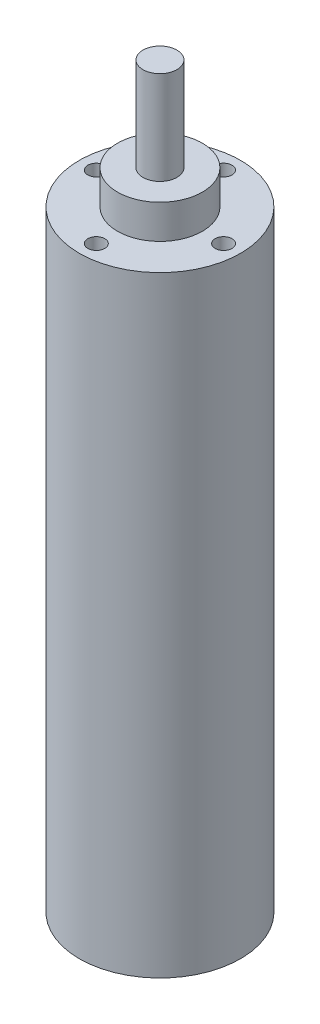
ISO-10303-21;
HEADER;
FILE_DESCRIPTION(('STEP AP214'),'2;1');
FILE_NAME('part.step','',(''),(''),'','','');
FILE_SCHEMA(('AUTOMOTIVE_DESIGN { 1 0 10303 214 1 1 1 1 }'));
ENDSEC;
DATA;
#1=APPLICATION_CONTEXT('core data for automotive mechanical design processes');
#2=APPLICATION_PROTOCOL_DEFINITION('international standard','automotive_design',2000,#1);
#3=PRODUCT_CONTEXT('',#1,'mechanical');
#4=PRODUCT('Part','Part','',(#3));
#5=PRODUCT_RELATED_PRODUCT_CATEGORY('part','',(#4));
#6=PRODUCT_DEFINITION_FORMATION('','',#4);
#7=PRODUCT_DEFINITION_CONTEXT('part definition',#1,'design');
#8=PRODUCT_DEFINITION('design','',#6,#7);
#9=PRODUCT_DEFINITION_SHAPE('','',#8);
#10=(LENGTH_UNIT() NAMED_UNIT(*) SI_UNIT(.MILLI.,.METRE.));
#11=(NAMED_UNIT(*) PLANE_ANGLE_UNIT() SI_UNIT($,.RADIAN.));
#12=(NAMED_UNIT(*) SI_UNIT($,.STERADIAN.) SOLID_ANGLE_UNIT());
#13=UNCERTAINTY_MEASURE_WITH_UNIT(LENGTH_MEASURE(1.E-05),#10,'distance_accuracy_value','');
#14=(GEOMETRIC_REPRESENTATION_CONTEXT(3) GLOBAL_UNCERTAINTY_ASSIGNED_CONTEXT((#13)) GLOBAL_UNIT_ASSIGNED_CONTEXT((#10,
#11,#12)) REPRESENTATION_CONTEXT('',''));
#15=CARTESIAN_POINT('',(0.,0.,0.));
#16=DIRECTION('',(0.,0.,1.));
#17=DIRECTION('',(1.,0.,0.));
#18=AXIS2_PLACEMENT_3D('',#15,#16,#17);
#19=CARTESIAN_POINT('',(0.,76.,0.));
#20=DIRECTION('',(0.,1.,0.));
#21=DIRECTION('',(0.,0.,1.));
#22=AXIS2_PLACEMENT_3D('',#19,#20,#21);
#23=PLANE('',#22);
#24=CARTESIAN_POINT('',(0.,76.,0.));
#25=DIRECTION('',(0.,1.,0.));
#26=DIRECTION('',(0.,0.,1.));
#27=AXIS2_PLACEMENT_3D('',#24,#25,#26);
#28=CIRCLE('',#27,5.);
#29=CARTESIAN_POINT('',(0.,76.,5.));
#30=VERTEX_POINT('',#29);
#31=EDGE_CURVE('E46',#30,#30,#28,.T.);
#32=ORIENTED_EDGE('',*,*,#31,.T.);
#33=EDGE_LOOP('',(#32));
#34=FACE_BOUND('',#33,.T.);
#35=CARTESIAN_POINT('',(0.,76.,0.));
#36=DIRECTION('',(0.,1.,0.));
#37=DIRECTION('',(0.,0.,1.));
#38=AXIS2_PLACEMENT_3D('',#35,#36,#37);
#39=CIRCLE('',#38,2.);
#40=CARTESIAN_POINT('',(0.,76.,2.));
#41=VERTEX_POINT('',#40);
#42=EDGE_CURVE('E54',#41,#41,#39,.T.);
#43=ORIENTED_EDGE('',*,*,#42,.F.);
#44=EDGE_LOOP('',(#43));
#45=FACE_BOUND('',#44,.T.);
#46=ADVANCED_FACE('F35',(#34,#45),#23,.T.);
#47=CARTESIAN_POINT('',(0.,72.,0.));
#48=DIRECTION('',(0.,1.,0.));
#49=DIRECTION('',(0.,0.,1.));
#50=AXIS2_PLACEMENT_3D('',#47,#48,#49);
#51=PLANE('',#50);
#52=CARTESIAN_POINT('',(0.,72.,-7.5));
#53=DIRECTION('',(0.,1.,0.));
#54=DIRECTION('',(0.,0.,1.));
#55=AXIS2_PLACEMENT_3D('',#52,#53,#54);
#56=CIRCLE('',#55,1.);
#57=CARTESIAN_POINT('',(0.,72.,-6.5));
#58=VERTEX_POINT('',#57);
#59=EDGE_CURVE('E63',#58,#58,#56,.T.);
#60=ORIENTED_EDGE('',*,*,#59,.F.);
#61=EDGE_LOOP('',(#60));
#62=FACE_BOUND('',#61,.T.);
#63=CARTESIAN_POINT('',(0.,72.,7.5));
#64=DIRECTION('',(0.,1.,0.));
#65=DIRECTION('',(0.,0.,1.));
#66=AXIS2_PLACEMENT_3D('',#63,#64,#65);
#67=CIRCLE('',#66,1.);
#68=CARTESIAN_POINT('',(0.,72.,8.5));
#69=VERTEX_POINT('',#68);
#70=EDGE_CURVE('E75',#69,#69,#67,.T.);
#71=ORIENTED_EDGE('',*,*,#70,.F.);
#72=EDGE_LOOP('',(#71));
#73=FACE_BOUND('',#72,.T.);
#74=CARTESIAN_POINT('',(-7.5,72.,0.));
#75=DIRECTION('',(0.,1.,0.));
#76=DIRECTION('',(0.,0.,1.));
#77=AXIS2_PLACEMENT_3D('',#74,#75,#76);
#78=CIRCLE('',#77,1.);
#79=CARTESIAN_POINT('',(-7.5,72.,1.));
#80=VERTEX_POINT('',#79);
#81=EDGE_CURVE('E69',#80,#80,#78,.T.);
#82=ORIENTED_EDGE('',*,*,#81,.F.);
#83=EDGE_LOOP('',(#82));
#84=FACE_BOUND('',#83,.T.);
#85=CARTESIAN_POINT('',(7.5,72.,0.));
#86=DIRECTION('',(0.,1.,0.));
#87=DIRECTION('',(0.,0.,1.));
#88=AXIS2_PLACEMENT_3D('',#85,#86,#87);
#89=CIRCLE('',#88,1.);
#90=CARTESIAN_POINT('',(7.5,72.,0.999999999999999));
#91=VERTEX_POINT('',#90);
#92=EDGE_CURVE('E60',#91,#91,#89,.T.);
#93=ORIENTED_EDGE('',*,*,#92,.F.);
#94=EDGE_LOOP('',(#93));
#95=FACE_BOUND('',#94,.T.);
#96=CARTESIAN_POINT('',(0.,72.,0.));
#97=DIRECTION('',(0.,1.,0.));
#98=DIRECTION('',(0.,0.,1.));
#99=AXIS2_PLACEMENT_3D('',#96,#97,#98);
#100=CIRCLE('',#99,9.5);
#101=CARTESIAN_POINT('',(0.,72.,9.5));
#102=VERTEX_POINT('',#101);
#103=EDGE_CURVE('E10',#102,#102,#100,.T.);
#104=ORIENTED_EDGE('',*,*,#103,.T.);
#105=EDGE_LOOP('',(#104));
#106=FACE_BOUND('',#105,.T.);
#107=CARTESIAN_POINT('',(0.,72.,0.));
#108=DIRECTION('',(0.,1.,0.));
#109=DIRECTION('',(0.,0.,1.));
#110=AXIS2_PLACEMENT_3D('',#107,#108,#109);
#111=CIRCLE('',#110,5.);
#112=CARTESIAN_POINT('',(0.,72.,5.));
#113=VERTEX_POINT('',#112);
#114=EDGE_CURVE('E48',#113,#113,#111,.T.);
#115=ORIENTED_EDGE('',*,*,#114,.F.);
#116=EDGE_LOOP('',(#115));
#117=FACE_BOUND('',#116,.T.);
#118=ADVANCED_FACE('F86',(#62,#73,#84,#95,#106,#117),#51,.T.);
#119=CARTESIAN_POINT('',(0.,72.,0.));
#120=DIRECTION('',(0.,-1.,0.));
#121=DIRECTION('',(0.,0.,-1.));
#122=AXIS2_PLACEMENT_3D('',#119,#120,#121);
#123=CYLINDRICAL_SURFACE('',#122,9.5);
#124=ORIENTED_EDGE('',*,*,#103,.F.);
#125=EDGE_LOOP('',(#124));
#126=FACE_BOUND('',#125,.T.);
#127=CARTESIAN_POINT('',(0.,0.,0.));
#128=DIRECTION('',(0.,1.,0.));
#129=DIRECTION('',(0.,0.,1.));
#130=AXIS2_PLACEMENT_3D('',#127,#128,#129);
#131=CIRCLE('',#130,9.5);
#132=CARTESIAN_POINT('',(0.,0.,9.5));
#133=VERTEX_POINT('',#132);
#134=EDGE_CURVE('E39',#133,#133,#131,.T.);
#135=ORIENTED_EDGE('',*,*,#134,.T.);
#136=EDGE_LOOP('',(#135));
#137=FACE_BOUND('',#136,.T.);
#138=ADVANCED_FACE('F37',(#126,#137),#123,.T.);
#139=CARTESIAN_POINT('',(0.,0.,0.));
#140=DIRECTION('',(0.,1.,0.));
#141=DIRECTION('',(0.,0.,1.));
#142=AXIS2_PLACEMENT_3D('',#139,#140,#141);
#143=PLANE('',#142);
#144=ORIENTED_EDGE('',*,*,#134,.F.);
#145=EDGE_LOOP('',(#144));
#146=FACE_BOUND('',#145,.T.);
#147=ADVANCED_FACE('F101',(#146),#143,.F.);
#148=CARTESIAN_POINT('',(0.,76.,0.));
#149=DIRECTION('',(0.,-1.,0.));
#150=DIRECTION('',(0.,0.,-1.));
#151=AXIS2_PLACEMENT_3D('',#148,#149,#150);
#152=CYLINDRICAL_SURFACE('',#151,5.);
#153=ORIENTED_EDGE('',*,*,#31,.F.);
#154=EDGE_LOOP('',(#153));
#155=FACE_BOUND('',#154,.T.);
#156=ORIENTED_EDGE('',*,*,#114,.T.);
#157=EDGE_LOOP('',(#156));
#158=FACE_BOUND('',#157,.T.);
#159=ADVANCED_FACE('F98',(#155,#158),#152,.T.);
#160=CARTESIAN_POINT('',(0.,87.,0.));
#161=DIRECTION('',(0.,-1.,0.));
#162=DIRECTION('',(0.,0.,-1.));
#163=AXIS2_PLACEMENT_3D('',#160,#161,#162);
#164=CYLINDRICAL_SURFACE('',#163,2.);
#165=CARTESIAN_POINT('',(0.,87.,0.));
#166=DIRECTION('',(0.,1.,0.));
#167=DIRECTION('',(0.,0.,1.));
#168=AXIS2_PLACEMENT_3D('',#165,#166,#167);
#169=CIRCLE('',#168,2.);
#170=CARTESIAN_POINT('',(0.,87.,2.));
#171=VERTEX_POINT('',#170);
#172=EDGE_CURVE('E51',#171,#171,#169,.T.);
#173=ORIENTED_EDGE('',*,*,#172,.F.);
#174=EDGE_LOOP('',(#173));
#175=FACE_BOUND('',#174,.T.);
#176=ORIENTED_EDGE('',*,*,#42,.T.);
#177=EDGE_LOOP('',(#176));
#178=FACE_BOUND('',#177,.T.);
#179=ADVANCED_FACE('F100',(#175,#178),#164,.T.);
#180=CARTESIAN_POINT('',(0.,87.,0.));
#181=DIRECTION('',(0.,1.,0.));
#182=DIRECTION('',(0.,0.,1.));
#183=AXIS2_PLACEMENT_3D('',#180,#181,#182);
#184=PLANE('',#183);
#185=ORIENTED_EDGE('',*,*,#172,.T.);
#186=EDGE_LOOP('',(#185));
#187=FACE_BOUND('',#186,.T.);
#188=ADVANCED_FACE('F108',(#187),#184,.T.);
#189=CARTESIAN_POINT('',(7.5,69.,0.));
#190=DIRECTION('',(0.,1.,0.));
#191=DIRECTION('',(0.,0.,1.));
#192=AXIS2_PLACEMENT_3D('',#189,#190,#191);
#193=CYLINDRICAL_SURFACE('',#192,1.);
#194=CARTESIAN_POINT('',(7.5,69.,0.));
#195=DIRECTION('',(0.,1.,0.));
#196=DIRECTION('',(0.,0.,1.));
#197=AXIS2_PLACEMENT_3D('',#194,#195,#196);
#198=CIRCLE('',#197,1.);
#199=CARTESIAN_POINT('',(7.5,69.,0.999999999999999));
#200=VERTEX_POINT('',#199);
#201=EDGE_CURVE('E57',#200,#200,#198,.T.);
#202=ORIENTED_EDGE('',*,*,#201,.F.);
#203=EDGE_LOOP('',(#202));
#204=FACE_BOUND('',#203,.T.);
#205=ORIENTED_EDGE('',*,*,#92,.T.);
#206=EDGE_LOOP('',(#205));
#207=FACE_BOUND('',#206,.T.);
#208=ADVANCED_FACE('F122',(#204,#207),#193,.F.);
#209=CARTESIAN_POINT('',(0.,69.,0.));
#210=DIRECTION('',(0.,1.,0.));
#211=DIRECTION('',(0.,0.,1.));
#212=AXIS2_PLACEMENT_3D('',#209,#210,#211);
#213=PLANE('',#212);
#214=ORIENTED_EDGE('',*,*,#201,.T.);
#215=EDGE_LOOP('',(#214));
#216=FACE_BOUND('',#215,.T.);
#217=ADVANCED_FACE('F126',(#216),#213,.T.);
#218=CARTESIAN_POINT('',(-7.5,69.,0.));
#219=DIRECTION('',(0.,1.,0.));
#220=DIRECTION('',(0.,0.,1.));
#221=AXIS2_PLACEMENT_3D('',#218,#219,#220);
#222=CYLINDRICAL_SURFACE('',#221,1.);
#223=CARTESIAN_POINT('',(-7.5,69.,0.));
#224=DIRECTION('',(0.,1.,0.));
#225=DIRECTION('',(0.,0.,1.));
#226=AXIS2_PLACEMENT_3D('',#223,#224,#225);
#227=CIRCLE('',#226,1.);
#228=CARTESIAN_POINT('',(-7.5,69.,1.));
#229=VERTEX_POINT('',#228);
#230=EDGE_CURVE('E66',#229,#229,#227,.T.);
#231=ORIENTED_EDGE('',*,*,#230,.F.);
#232=EDGE_LOOP('',(#231));
#233=FACE_BOUND('',#232,.T.);
#234=ORIENTED_EDGE('',*,*,#81,.T.);
#235=EDGE_LOOP('',(#234));
#236=FACE_BOUND('',#235,.T.);
#237=ADVANCED_FACE('F130',(#233,#236),#222,.F.);
#238=CARTESIAN_POINT('',(-7.5,69.,0.));
#239=DIRECTION('',(0.,1.,0.));
#240=DIRECTION('',(0.,0.,1.));
#241=AXIS2_PLACEMENT_3D('',#238,#239,#240);
#242=PLANE('',#241);
#243=ORIENTED_EDGE('',*,*,#230,.T.);
#244=EDGE_LOOP('',(#243));
#245=FACE_BOUND('',#244,.T.);
#246=ADVANCED_FACE('F132',(#245),#242,.T.);
#247=CARTESIAN_POINT('',(0.,69.,7.5));
#248=DIRECTION('',(0.,1.,0.));
#249=DIRECTION('',(0.,0.,1.));
#250=AXIS2_PLACEMENT_3D('',#247,#248,#249);
#251=CYLINDRICAL_SURFACE('',#250,1.);
#252=CARTESIAN_POINT('',(0.,69.,7.5));
#253=DIRECTION('',(0.,1.,0.));
#254=DIRECTION('',(0.,0.,1.));
#255=AXIS2_PLACEMENT_3D('',#252,#253,#254);
#256=CIRCLE('',#255,1.);
#257=CARTESIAN_POINT('',(0.,69.,8.5));
#258=VERTEX_POINT('',#257);
#259=EDGE_CURVE('E72',#258,#258,#256,.T.);
#260=ORIENTED_EDGE('',*,*,#259,.F.);
#261=EDGE_LOOP('',(#260));
#262=FACE_BOUND('',#261,.T.);
#263=ORIENTED_EDGE('',*,*,#70,.T.);
#264=EDGE_LOOP('',(#263));
#265=FACE_BOUND('',#264,.T.);
#266=ADVANCED_FACE('F135',(#262,#265),#251,.F.);
#267=CARTESIAN_POINT('',(0.,69.,7.5));
#268=DIRECTION('',(0.,1.,0.));
#269=DIRECTION('',(0.,0.,1.));
#270=AXIS2_PLACEMENT_3D('',#267,#268,#269);
#271=PLANE('',#270);
#272=ORIENTED_EDGE('',*,*,#259,.T.);
#273=EDGE_LOOP('',(#272));
#274=FACE_BOUND('',#273,.T.);
#275=ADVANCED_FACE('F140',(#274),#271,.T.);
#276=CARTESIAN_POINT('',(0.,69.,-7.5));
#277=DIRECTION('',(0.,1.,0.));
#278=DIRECTION('',(0.,0.,1.));
#279=AXIS2_PLACEMENT_3D('',#276,#277,#278);
#280=CYLINDRICAL_SURFACE('',#279,1.);
#281=CARTESIAN_POINT('',(0.,69.,-7.5));
#282=DIRECTION('',(0.,1.,0.));
#283=DIRECTION('',(0.,0.,1.));
#284=AXIS2_PLACEMENT_3D('',#281,#282,#283);
#285=CIRCLE('',#284,1.);
#286=CARTESIAN_POINT('',(0.,69.,-6.5));
#287=VERTEX_POINT('',#286);
#288=EDGE_CURVE('E78',#287,#287,#285,.T.);
#289=ORIENTED_EDGE('',*,*,#288,.F.);
#290=EDGE_LOOP('',(#289));
#291=FACE_BOUND('',#290,.T.);
#292=ORIENTED_EDGE('',*,*,#59,.T.);
#293=EDGE_LOOP('',(#292));
#294=FACE_BOUND('',#293,.T.);
#295=ADVANCED_FACE('F84',(#291,#294),#280,.F.);
#296=CARTESIAN_POINT('',(0.,69.,0.));
#297=DIRECTION('',(0.,1.,0.));
#298=DIRECTION('',(0.,0.,1.));
#299=AXIS2_PLACEMENT_3D('',#296,#297,#298);
#300=PLANE('',#299);
#301=ORIENTED_EDGE('',*,*,#288,.T.);
#302=EDGE_LOOP('',(#301));
#303=FACE_BOUND('',#302,.T.);
#304=ADVANCED_FACE('F147',(#303),#300,.T.);
#305=CLOSED_SHELL('',(#46,#118,#138,#147,#159,#179,#188,#208,#217,#237,#246,#266,#275,#295,#304));
#306=MANIFOLD_SOLID_BREP('B2',#305);
#307=ADVANCED_BREP_SHAPE_REPRESENTATION('',(#18,#306),#14);
#308=SHAPE_DEFINITION_REPRESENTATION(#9,#307);
ENDSEC;
END-ISO-10303-21;
